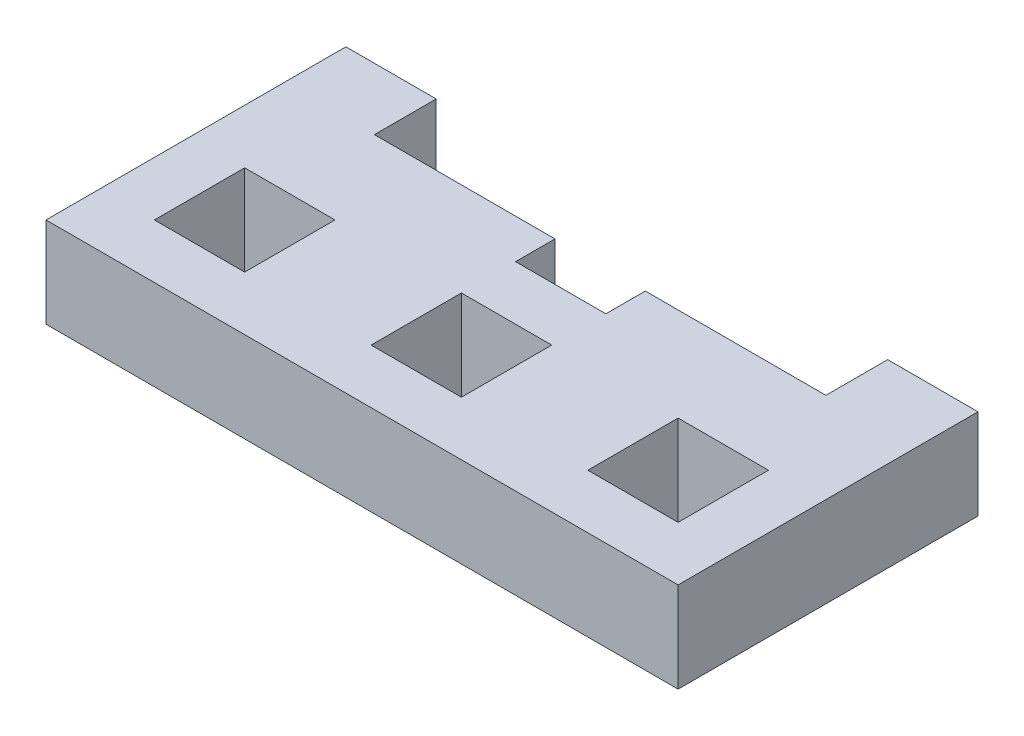
ISO-10303-21;
HEADER;
FILE_DESCRIPTION(('STEP AP214'),'2;1');
FILE_NAME('part.step','',(''),(''),'','','');
FILE_SCHEMA(('AUTOMOTIVE_DESIGN { 1 0 10303 214 1 1 1 1 }'));
ENDSEC;
DATA;
#1=APPLICATION_CONTEXT('core data for automotive mechanical design processes');
#2=APPLICATION_PROTOCOL_DEFINITION('international standard','automotive_design',2000,#1);
#3=PRODUCT_CONTEXT('',#1,'mechanical');
#4=PRODUCT('Part','Part','',(#3));
#5=PRODUCT_RELATED_PRODUCT_CATEGORY('part','',(#4));
#6=PRODUCT_DEFINITION_FORMATION('','',#4);
#7=PRODUCT_DEFINITION_CONTEXT('part definition',#1,'design');
#8=PRODUCT_DEFINITION('design','',#6,#7);
#9=PRODUCT_DEFINITION_SHAPE('','',#8);
#10=(LENGTH_UNIT() NAMED_UNIT(*) SI_UNIT(.MILLI.,.METRE.));
#11=(NAMED_UNIT(*) PLANE_ANGLE_UNIT() SI_UNIT($,.RADIAN.));
#12=(NAMED_UNIT(*) SI_UNIT($,.STERADIAN.) SOLID_ANGLE_UNIT());
#13=UNCERTAINTY_MEASURE_WITH_UNIT(LENGTH_MEASURE(1.E-05),#10,'distance_accuracy_value','');
#14=(GEOMETRIC_REPRESENTATION_CONTEXT(3) GLOBAL_UNCERTAINTY_ASSIGNED_CONTEXT((#13)) GLOBAL_UNIT_ASSIGNED_CONTEXT((#10,
#11,#12)) REPRESENTATION_CONTEXT('',''));
#15=CARTESIAN_POINT('',(0.,0.,0.));
#16=DIRECTION('',(0.,0.,1.));
#17=DIRECTION('',(1.,0.,0.));
#18=AXIS2_PLACEMENT_3D('',#15,#16,#17);
#19=CARTESIAN_POINT('',(0.,6.35,0.));
#20=DIRECTION('',(0.,-1.,0.));
#21=DIRECTION('',(0.,0.,-1.));
#22=AXIS2_PLACEMENT_3D('',#19,#20,#21);
#23=PLANE('',#22);
#24=DIRECTION('',(0.,0.,-1.));
#25=VECTOR('',#24,1.);
#26=CARTESIAN_POINT('',(18.415,6.35,3.175));
#27=LINE('',#26,#25);
#28=CARTESIAN_POINT('',(18.415,6.35,3.175));
#29=VERTEX_POINT('',#28);
#30=CARTESIAN_POINT('',(18.415,6.35,-3.175));
#31=VERTEX_POINT('',#30);
#32=EDGE_CURVE('E229',#29,#31,#27,.T.);
#33=ORIENTED_EDGE('',*,*,#32,.F.);
#34=DIRECTION('',(1.,0.,0.));
#35=VECTOR('',#34,1.);
#36=CARTESIAN_POINT('',(18.415,6.35,3.175));
#37=LINE('',#36,#35);
#38=CARTESIAN_POINT('',(12.065,6.35,3.175));
#39=VERTEX_POINT('',#38);
#40=EDGE_CURVE('E237',#39,#29,#37,.T.);
#41=ORIENTED_EDGE('',*,*,#40,.F.);
#42=DIRECTION('',(0.,0.,1.));
#43=VECTOR('',#42,1.);
#44=CARTESIAN_POINT('',(12.065,6.35,3.175));
#45=LINE('',#44,#43);
#46=CARTESIAN_POINT('',(12.065,6.35,-3.175));
#47=VERTEX_POINT('',#46);
#48=EDGE_CURVE('E234',#47,#39,#45,.T.);
#49=ORIENTED_EDGE('',*,*,#48,.F.);
#50=DIRECTION('',(-1.,0.,0.));
#51=VECTOR('',#50,1.);
#52=CARTESIAN_POINT('',(18.415,6.35,-3.175));
#53=LINE('',#52,#51);
#54=EDGE_CURVE('E231',#31,#47,#53,.T.);
#55=ORIENTED_EDGE('',*,*,#54,.F.);
#56=EDGE_LOOP('',(#33,#41,#49,#55));
#57=FACE_BOUND('',#56,.T.);
#58=DIRECTION('',(0.,0.,1.));
#59=VECTOR('',#58,1.);
#60=CARTESIAN_POINT('',(-22.225,6.35,6.985));
#61=LINE('',#60,#59);
#62=CARTESIAN_POINT('',(-22.225,6.35,-14.102499989));
#63=VERTEX_POINT('',#62);
#64=CARTESIAN_POINT('',(-22.225,6.35,6.985));
#65=VERTEX_POINT('',#64);
#66=EDGE_CURVE('E291',#63,#65,#61,.T.);
#67=ORIENTED_EDGE('',*,*,#66,.T.);
#68=DIRECTION('',(1.,0.,0.));
#69=VECTOR('',#68,1.);
#70=CARTESIAN_POINT('',(-22.225,6.35,6.985));
#71=LINE('',#70,#69);
#72=CARTESIAN_POINT('',(22.225,6.35,6.985));
#73=VERTEX_POINT('',#72);
#74=EDGE_CURVE('E294',#65,#73,#71,.T.);
#75=ORIENTED_EDGE('',*,*,#74,.T.);
#76=DIRECTION('',(0.,0.,-1.));
#77=VECTOR('',#76,1.);
#78=CARTESIAN_POINT('',(22.225,6.35,6.985));
#79=LINE('',#78,#77);
#80=CARTESIAN_POINT('',(22.225,6.35,-14.102499989));
#81=VERTEX_POINT('',#80);
#82=EDGE_CURVE('E297',#73,#81,#79,.T.);
#83=ORIENTED_EDGE('',*,*,#82,.T.);
#84=DIRECTION('',(-1.,0.,0.));
#85=VECTOR('',#84,1.);
#86=CARTESIAN_POINT('',(22.225,6.35,-14.102499989));
#87=LINE('',#86,#85);
#88=CARTESIAN_POINT('',(15.875,6.35,-14.102499989));
#89=VERTEX_POINT('',#88);
#90=EDGE_CURVE('E299',#81,#89,#87,.T.);
#91=ORIENTED_EDGE('',*,*,#90,.T.);
#92=DIRECTION('',(0.,0.,1.));
#93=VECTOR('',#92,1.);
#94=CARTESIAN_POINT('',(15.875,6.35,-14.102499989));
#95=LINE('',#94,#93);
#96=CARTESIAN_POINT('',(15.875,6.35,-9.75750004299999));
#97=VERTEX_POINT('',#96);
#98=EDGE_CURVE('E301',#89,#97,#95,.T.);
#99=ORIENTED_EDGE('',*,*,#98,.T.);
#100=DIRECTION('',(-1.,0.,0.));
#101=VECTOR('',#100,1.);
#102=CARTESIAN_POINT('',(3.175,6.35,-9.75750004299999));
#103=LINE('',#102,#101);
#104=CARTESIAN_POINT('',(3.175,6.35,-9.75750004299999));
#105=VERTEX_POINT('',#104);
#106=EDGE_CURVE('E303',#97,#105,#103,.T.);
#107=ORIENTED_EDGE('',*,*,#106,.T.);
#108=DIRECTION('',(0.,0.,1.));
#109=VECTOR('',#108,1.);
#110=CARTESIAN_POINT('',(3.175,6.35,-6.985));
#111=LINE('',#110,#109);
#112=CARTESIAN_POINT('',(3.175,6.35,-6.985));
#113=VERTEX_POINT('',#112);
#114=EDGE_CURVE('E305',#105,#113,#111,.T.);
#115=ORIENTED_EDGE('',*,*,#114,.T.);
#116=DIRECTION('',(-1.,0.,0.));
#117=VECTOR('',#116,1.);
#118=CARTESIAN_POINT('',(-3.175,6.35,-6.98500000000001));
#119=LINE('',#118,#117);
#120=CARTESIAN_POINT('',(-3.175,6.35,-6.98500000000001));
#121=VERTEX_POINT('',#120);
#122=EDGE_CURVE('E307',#113,#121,#119,.T.);
#123=ORIENTED_EDGE('',*,*,#122,.T.);
#124=DIRECTION('',(0.,0.,-1.));
#125=VECTOR('',#124,1.);
#126=CARTESIAN_POINT('',(-3.175,6.35,-9.75750004299999));
#127=LINE('',#126,#125);
#128=CARTESIAN_POINT('',(-3.175,6.35,-9.75750004299999));
#129=VERTEX_POINT('',#128);
#130=EDGE_CURVE('E309',#121,#129,#127,.T.);
#131=ORIENTED_EDGE('',*,*,#130,.T.);
#132=DIRECTION('',(-1.,0.,0.));
#133=VECTOR('',#132,1.);
#134=CARTESIAN_POINT('',(-15.875,6.35,-9.75750004299999));
#135=LINE('',#134,#133);
#136=CARTESIAN_POINT('',(-15.875,6.35,-9.75750004299999));
#137=VERTEX_POINT('',#136);
#138=EDGE_CURVE('E311',#129,#137,#135,.T.);
#139=ORIENTED_EDGE('',*,*,#138,.T.);
#140=DIRECTION('',(0.,0.,-1.));
#141=VECTOR('',#140,1.);
#142=CARTESIAN_POINT('',(-15.875,6.35,-14.102499989));
#143=LINE('',#142,#141);
#144=CARTESIAN_POINT('',(-15.875,6.35,-14.102499989));
#145=VERTEX_POINT('',#144);
#146=EDGE_CURVE('E313',#137,#145,#143,.T.);
#147=ORIENTED_EDGE('',*,*,#146,.T.);
#148=DIRECTION('',(-1.,0.,0.));
#149=VECTOR('',#148,1.);
#150=CARTESIAN_POINT('',(-22.225,6.35,-14.102499989));
#151=LINE('',#150,#149);
#152=EDGE_CURVE('E315',#145,#63,#151,.T.);
#153=ORIENTED_EDGE('',*,*,#152,.T.);
#154=EDGE_LOOP('',(#67,#75,#83,#91,#99,#107,#115,#123,#131,#139,#147,#153));
#155=FACE_BOUND('',#154,.T.);
#156=DIRECTION('',(0.,0.,-1.));
#157=VECTOR('',#156,1.);
#158=CARTESIAN_POINT('',(3.175,6.35,-3.17500000000001));
#159=LINE('',#158,#157);
#160=CARTESIAN_POINT('',(3.175,6.35,3.17500000000001));
#161=VERTEX_POINT('',#160);
#162=CARTESIAN_POINT('',(3.175,6.35,-3.17500000000001));
#163=VERTEX_POINT('',#162);
#164=EDGE_CURVE('E260',#161,#163,#159,.T.);
#165=ORIENTED_EDGE('',*,*,#164,.F.);
#166=DIRECTION('',(1.,0.,0.));
#167=VECTOR('',#166,1.);
#168=CARTESIAN_POINT('',(-3.17500000000002,6.35,3.17500000000002));
#169=LINE('',#168,#167);
#170=CARTESIAN_POINT('',(-3.17500000000002,6.35,3.17500000000002));
#171=VERTEX_POINT('',#170);
#172=EDGE_CURVE('E268',#171,#161,#169,.T.);
#173=ORIENTED_EDGE('',*,*,#172,.F.);
#174=DIRECTION('',(0.,0.,1.));
#175=VECTOR('',#174,1.);
#176=CARTESIAN_POINT('',(-3.17500000000002,6.35,-3.17500000000001));
#177=LINE('',#176,#175);
#178=CARTESIAN_POINT('',(-3.17500000000002,6.35,-3.17500000000001));
#179=VERTEX_POINT('',#178);
#180=EDGE_CURVE('E265',#179,#171,#177,.T.);
#181=ORIENTED_EDGE('',*,*,#180,.F.);
#182=DIRECTION('',(-1.,0.,0.));
#183=VECTOR('',#182,1.);
#184=CARTESIAN_POINT('',(-3.17500000000002,6.35,-3.17500000000001));
#185=LINE('',#184,#183);
#186=EDGE_CURVE('E262',#163,#179,#185,.T.);
#187=ORIENTED_EDGE('',*,*,#186,.F.);
#188=EDGE_LOOP('',(#165,#173,#181,#187));
#189=FACE_BOUND('',#188,.T.);
#190=DIRECTION('',(1.,0.,0.));
#191=VECTOR('',#190,1.);
#192=CARTESIAN_POINT('',(-18.415,6.35,3.175));
#193=LINE('',#192,#191);
#194=CARTESIAN_POINT('',(-18.415,6.35,3.175));
#195=VERTEX_POINT('',#194);
#196=CARTESIAN_POINT('',(-12.065,6.35,3.175));
#197=VERTEX_POINT('',#196);
#198=EDGE_CURVE('E193',#195,#197,#193,.T.);
#199=ORIENTED_EDGE('',*,*,#198,.F.);
#200=DIRECTION('',(0.,0.,1.));
#201=VECTOR('',#200,1.);
#202=CARTESIAN_POINT('',(-18.415,6.35,3.175));
#203=LINE('',#202,#201);
#204=CARTESIAN_POINT('',(-18.415,6.35,-3.175));
#205=VERTEX_POINT('',#204);
#206=EDGE_CURVE('E215',#205,#195,#203,.T.);
#207=ORIENTED_EDGE('',*,*,#206,.F.);
#208=DIRECTION('',(-1.,0.,0.));
#209=VECTOR('',#208,1.);
#210=CARTESIAN_POINT('',(-18.415,6.35,-3.175));
#211=LINE('',#210,#209);
#212=CARTESIAN_POINT('',(-12.065,6.35,-3.175));
#213=VERTEX_POINT('',#212);
#214=EDGE_CURVE('E213',#213,#205,#211,.T.);
#215=ORIENTED_EDGE('',*,*,#214,.F.);
#216=DIRECTION('',(0.,0.,-1.));
#217=VECTOR('',#216,1.);
#218=CARTESIAN_POINT('',(-12.065,6.35,3.175));
#219=LINE('',#218,#217);
#220=EDGE_CURVE('E201',#197,#213,#219,.T.);
#221=ORIENTED_EDGE('',*,*,#220,.F.);
#222=EDGE_LOOP('',(#199,#207,#215,#221));
#223=FACE_BOUND('',#222,.T.);
#224=ADVANCED_FACE('F32',(#57,#155,#189,#223),#23,.F.);
#225=CARTESIAN_POINT('',(0.,0.,0.));
#226=DIRECTION('',(0.,-1.,0.));
#227=DIRECTION('',(0.,0.,-1.));
#228=AXIS2_PLACEMENT_3D('',#225,#226,#227);
#229=PLANE('',#228);
#230=DIRECTION('',(1.,0.,0.));
#231=VECTOR('',#230,1.);
#232=CARTESIAN_POINT('',(18.415,0.,3.175));
#233=LINE('',#232,#231);
#234=CARTESIAN_POINT('',(12.065,0.,3.175));
#235=VERTEX_POINT('',#234);
#236=CARTESIAN_POINT('',(18.415,0.,3.175));
#237=VERTEX_POINT('',#236);
#238=EDGE_CURVE('E232',#235,#237,#233,.T.);
#239=ORIENTED_EDGE('',*,*,#238,.T.);
#240=DIRECTION('',(0.,0.,-1.));
#241=VECTOR('',#240,1.);
#242=CARTESIAN_POINT('',(18.415,0.,3.175));
#243=LINE('',#242,#241);
#244=CARTESIAN_POINT('',(18.415,0.,-3.175));
#245=VERTEX_POINT('',#244);
#246=EDGE_CURVE('E209',#237,#245,#243,.T.);
#247=ORIENTED_EDGE('',*,*,#246,.T.);
#248=DIRECTION('',(-1.,0.,0.));
#249=VECTOR('',#248,1.);
#250=CARTESIAN_POINT('',(18.415,0.,-3.175));
#251=LINE('',#250,#249);
#252=CARTESIAN_POINT('',(12.065,0.,-3.175));
#253=VERTEX_POINT('',#252);
#254=EDGE_CURVE('E242',#245,#253,#251,.T.);
#255=ORIENTED_EDGE('',*,*,#254,.T.);
#256=DIRECTION('',(0.,0.,1.));
#257=VECTOR('',#256,1.);
#258=CARTESIAN_POINT('',(12.065,0.,3.175));
#259=LINE('',#258,#257);
#260=EDGE_CURVE('E245',#253,#235,#259,.T.);
#261=ORIENTED_EDGE('',*,*,#260,.T.);
#262=EDGE_LOOP('',(#239,#247,#255,#261));
#263=FACE_BOUND('',#262,.T.);
#264=DIRECTION('',(1.,0.,0.));
#265=VECTOR('',#264,1.);
#266=CARTESIAN_POINT('',(-22.225,0.,6.985));
#267=LINE('',#266,#265);
#268=CARTESIAN_POINT('',(-22.225,0.,6.985));
#269=VERTEX_POINT('',#268);
#270=CARTESIAN_POINT('',(22.225,0.,6.985));
#271=VERTEX_POINT('',#270);
#272=EDGE_CURVE('E290',#269,#271,#267,.T.);
#273=ORIENTED_EDGE('',*,*,#272,.F.);
#274=DIRECTION('',(0.,0.,1.));
#275=VECTOR('',#274,1.);
#276=CARTESIAN_POINT('',(-22.225,0.,-9.75750004299999));
#277=LINE('',#276,#275);
#278=CARTESIAN_POINT('',(-22.225,0.,-14.102499989));
#279=VERTEX_POINT('',#278);
#280=EDGE_CURVE('E295',#279,#269,#277,.T.);
#281=ORIENTED_EDGE('',*,*,#280,.F.);
#282=DIRECTION('',(-1.,0.,0.));
#283=VECTOR('',#282,1.);
#284=CARTESIAN_POINT('',(-22.225,0.,-14.102499989));
#285=LINE('',#284,#283);
#286=CARTESIAN_POINT('',(-15.875,0.,-14.102499989));
#287=VERTEX_POINT('',#286);
#288=EDGE_CURVE('E339',#287,#279,#285,.T.);
#289=ORIENTED_EDGE('',*,*,#288,.F.);
#290=DIRECTION('',(0.,0.,-1.));
#291=VECTOR('',#290,1.);
#292=CARTESIAN_POINT('',(-15.875,0.,-14.102499989));
#293=LINE('',#292,#291);
#294=CARTESIAN_POINT('',(-15.875,0.,-9.75750004299999));
#295=VERTEX_POINT('',#294);
#296=EDGE_CURVE('E337',#295,#287,#293,.T.);
#297=ORIENTED_EDGE('',*,*,#296,.F.);
#298=DIRECTION('',(-1.,0.,0.));
#299=VECTOR('',#298,1.);
#300=CARTESIAN_POINT('',(-15.875,0.,-9.75750004299999));
#301=LINE('',#300,#299);
#302=CARTESIAN_POINT('',(-3.175,0.,-9.75750004299999));
#303=VERTEX_POINT('',#302);
#304=EDGE_CURVE('E335',#303,#295,#301,.T.);
#305=ORIENTED_EDGE('',*,*,#304,.F.);
#306=DIRECTION('',(0.,0.,-1.));
#307=VECTOR('',#306,1.);
#308=CARTESIAN_POINT('',(-3.175,0.,-9.75750004299999));
#309=LINE('',#308,#307);
#310=CARTESIAN_POINT('',(-3.175,0.,-6.98500000000001));
#311=VERTEX_POINT('',#310);
#312=EDGE_CURVE('E333',#311,#303,#309,.T.);
#313=ORIENTED_EDGE('',*,*,#312,.F.);
#314=DIRECTION('',(-1.,0.,0.));
#315=VECTOR('',#314,1.);
#316=CARTESIAN_POINT('',(-3.175,0.,-6.98500000000001));
#317=LINE('',#316,#315);
#318=CARTESIAN_POINT('',(3.175,0.,-6.985));
#319=VERTEX_POINT('',#318);
#320=EDGE_CURVE('E331',#319,#311,#317,.T.);
#321=ORIENTED_EDGE('',*,*,#320,.F.);
#322=DIRECTION('',(0.,0.,1.));
#323=VECTOR('',#322,1.);
#324=CARTESIAN_POINT('',(3.175,0.,-6.985));
#325=LINE('',#324,#323);
#326=CARTESIAN_POINT('',(3.175,0.,-9.75750004299999));
#327=VERTEX_POINT('',#326);
#328=EDGE_CURVE('E329',#327,#319,#325,.T.);
#329=ORIENTED_EDGE('',*,*,#328,.F.);
#330=DIRECTION('',(-1.,0.,0.));
#331=VECTOR('',#330,1.);
#332=CARTESIAN_POINT('',(3.175,0.,-9.75750004299999));
#333=LINE('',#332,#331);
#334=CARTESIAN_POINT('',(15.875,0.,-9.75750004299999));
#335=VERTEX_POINT('',#334);
#336=EDGE_CURVE('E327',#335,#327,#333,.T.);
#337=ORIENTED_EDGE('',*,*,#336,.F.);
#338=DIRECTION('',(0.,0.,1.));
#339=VECTOR('',#338,1.);
#340=CARTESIAN_POINT('',(15.875,0.,-14.102499989));
#341=LINE('',#340,#339);
#342=CARTESIAN_POINT('',(15.875,0.,-14.102499989));
#343=VERTEX_POINT('',#342);
#344=EDGE_CURVE('E325',#343,#335,#341,.T.);
#345=ORIENTED_EDGE('',*,*,#344,.F.);
#346=DIRECTION('',(-1.,0.,0.));
#347=VECTOR('',#346,1.);
#348=CARTESIAN_POINT('',(22.225,0.,-14.102499989));
#349=LINE('',#348,#347);
#350=CARTESIAN_POINT('',(22.225,0.,-14.102499989));
#351=VERTEX_POINT('',#350);
#352=EDGE_CURVE('E323',#351,#343,#349,.T.);
#353=ORIENTED_EDGE('',*,*,#352,.F.);
#354=DIRECTION('',(0.,0.,-1.));
#355=VECTOR('',#354,1.);
#356=CARTESIAN_POINT('',(22.225,0.,-9.75750004299999));
#357=LINE('',#356,#355);
#358=EDGE_CURVE('E321',#271,#351,#357,.T.);
#359=ORIENTED_EDGE('',*,*,#358,.F.);
#360=EDGE_LOOP('',(#273,#281,#289,#297,#305,#313,#321,#329,#337,#345,#353,#359));
#361=FACE_BOUND('',#360,.T.);
#362=DIRECTION('',(1.,0.,0.));
#363=VECTOR('',#362,1.);
#364=CARTESIAN_POINT('',(-3.17500000000002,0.,3.17500000000002));
#365=LINE('',#364,#363);
#366=CARTESIAN_POINT('',(-3.17500000000002,0.,3.17500000000002));
#367=VERTEX_POINT('',#366);
#368=CARTESIAN_POINT('',(3.175,0.,3.17500000000001));
#369=VERTEX_POINT('',#368);
#370=EDGE_CURVE('E263',#367,#369,#365,.T.);
#371=ORIENTED_EDGE('',*,*,#370,.T.);
#372=DIRECTION('',(0.,0.,-1.));
#373=VECTOR('',#372,1.);
#374=CARTESIAN_POINT('',(3.175,0.,-3.17500000000001));
#375=LINE('',#374,#373);
#376=CARTESIAN_POINT('',(3.175,0.,-3.17500000000001));
#377=VERTEX_POINT('',#376);
#378=EDGE_CURVE('E259',#369,#377,#375,.T.);
#379=ORIENTED_EDGE('',*,*,#378,.T.);
#380=DIRECTION('',(-1.,0.,0.));
#381=VECTOR('',#380,1.);
#382=CARTESIAN_POINT('',(-3.17500000000002,0.,-3.17500000000001));
#383=LINE('',#382,#381);
#384=CARTESIAN_POINT('',(-3.17500000000002,0.,-3.17500000000001));
#385=VERTEX_POINT('',#384);
#386=EDGE_CURVE('E273',#377,#385,#383,.T.);
#387=ORIENTED_EDGE('',*,*,#386,.T.);
#388=DIRECTION('',(0.,0.,1.));
#389=VECTOR('',#388,1.);
#390=CARTESIAN_POINT('',(-3.17500000000002,0.,-3.17500000000001));
#391=LINE('',#390,#389);
#392=EDGE_CURVE('E276',#385,#367,#391,.T.);
#393=ORIENTED_EDGE('',*,*,#392,.T.);
#394=EDGE_LOOP('',(#371,#379,#387,#393));
#395=FACE_BOUND('',#394,.T.);
#396=DIRECTION('',(0.,0.,1.));
#397=VECTOR('',#396,1.);
#398=CARTESIAN_POINT('',(-18.415,0.,3.175));
#399=LINE('',#398,#397);
#400=CARTESIAN_POINT('',(-18.415,0.,-3.175));
#401=VERTEX_POINT('',#400);
#402=CARTESIAN_POINT('',(-18.415,0.,3.175));
#403=VERTEX_POINT('',#402);
#404=EDGE_CURVE('E202',#401,#403,#399,.T.);
#405=ORIENTED_EDGE('',*,*,#404,.T.);
#406=DIRECTION('',(1.,0.,0.));
#407=VECTOR('',#406,1.);
#408=CARTESIAN_POINT('',(-18.415,0.,3.175));
#409=LINE('',#408,#407);
#410=CARTESIAN_POINT('',(-12.065,0.,3.175));
#411=VERTEX_POINT('',#410);
#412=EDGE_CURVE('E55',#403,#411,#409,.T.);
#413=ORIENTED_EDGE('',*,*,#412,.T.);
#414=DIRECTION('',(0.,0.,-1.));
#415=VECTOR('',#414,1.);
#416=CARTESIAN_POINT('',(-12.065,0.,3.175));
#417=LINE('',#416,#415);
#418=CARTESIAN_POINT('',(-12.065,0.,-3.175));
#419=VERTEX_POINT('',#418);
#420=EDGE_CURVE('E208',#411,#419,#417,.T.);
#421=ORIENTED_EDGE('',*,*,#420,.T.);
#422=DIRECTION('',(-1.,0.,0.));
#423=VECTOR('',#422,1.);
#424=CARTESIAN_POINT('',(-18.415,0.,-3.175));
#425=LINE('',#424,#423);
#426=EDGE_CURVE('E221',#419,#401,#425,.T.);
#427=ORIENTED_EDGE('',*,*,#426,.T.);
#428=EDGE_LOOP('',(#405,#413,#421,#427));
#429=FACE_BOUND('',#428,.T.);
#430=ADVANCED_FACE('F381',(#263,#361,#395,#429),#229,.T.);
#431=CARTESIAN_POINT('',(-22.225,6.35,6.985));
#432=DIRECTION('',(0.,0.,-1.));
#433=DIRECTION('',(-1.,0.,0.));
#434=AXIS2_PLACEMENT_3D('',#431,#432,#433);
#435=PLANE('',#434);
#436=ORIENTED_EDGE('',*,*,#272,.T.);
#437=DIRECTION('',(0.,-1.,0.));
#438=VECTOR('',#437,1.);
#439=CARTESIAN_POINT('',(22.225,6.35,6.985));
#440=LINE('',#439,#438);
#441=EDGE_CURVE('E40',#73,#271,#440,.T.);
#442=ORIENTED_EDGE('',*,*,#441,.F.);
#443=ORIENTED_EDGE('',*,*,#74,.F.);
#444=DIRECTION('',(0.,-1.,0.));
#445=VECTOR('',#444,1.);
#446=CARTESIAN_POINT('',(-22.225,6.35,6.985));
#447=LINE('',#446,#445);
#448=EDGE_CURVE('E11',#65,#269,#447,.T.);
#449=ORIENTED_EDGE('',*,*,#448,.T.);
#450=EDGE_LOOP('',(#436,#442,#443,#449));
#451=FACE_BOUND('',#450,.T.);
#452=ADVANCED_FACE('F34',(#451),#435,.F.);
#453=CARTESIAN_POINT('',(22.225,6.35,-9.75750004299999));
#454=DIRECTION('',(-1.,0.,0.));
#455=DIRECTION('',(0.,0.,1.));
#456=AXIS2_PLACEMENT_3D('',#453,#454,#455);
#457=PLANE('',#456);
#458=ORIENTED_EDGE('',*,*,#358,.T.);
#459=DIRECTION('',(0.,-1.,0.));
#460=VECTOR('',#459,1.);
#461=CARTESIAN_POINT('',(22.225,6.35,-14.102499989));
#462=LINE('',#461,#460);
#463=EDGE_CURVE('E368',#81,#351,#462,.T.);
#464=ORIENTED_EDGE('',*,*,#463,.F.);
#465=ORIENTED_EDGE('',*,*,#82,.F.);
#466=ORIENTED_EDGE('',*,*,#441,.T.);
#467=EDGE_LOOP('',(#458,#464,#465,#466));
#468=FACE_BOUND('',#467,.T.);
#469=ADVANCED_FACE('F374',(#468),#457,.F.);
#470=CARTESIAN_POINT('',(22.225,6.35,-14.102499989));
#471=DIRECTION('',(0.,0.,1.));
#472=DIRECTION('',(1.,0.,0.));
#473=AXIS2_PLACEMENT_3D('',#470,#471,#472);
#474=PLANE('',#473);
#475=ORIENTED_EDGE('',*,*,#352,.T.);
#476=DIRECTION('',(0.,-1.,0.));
#477=VECTOR('',#476,1.);
#478=CARTESIAN_POINT('',(15.875,6.35,-14.102499989));
#479=LINE('',#478,#477);
#480=EDGE_CURVE('E365',#89,#343,#479,.T.);
#481=ORIENTED_EDGE('',*,*,#480,.F.);
#482=ORIENTED_EDGE('',*,*,#90,.F.);
#483=ORIENTED_EDGE('',*,*,#463,.T.);
#484=EDGE_LOOP('',(#475,#481,#482,#483));
#485=FACE_BOUND('',#484,.T.);
#486=ADVANCED_FACE('F389',(#485),#474,.F.);
#487=CARTESIAN_POINT('',(15.875,6.35,-14.102499989));
#488=DIRECTION('',(1.,0.,0.));
#489=DIRECTION('',(0.,0.,-1.));
#490=AXIS2_PLACEMENT_3D('',#487,#488,#489);
#491=PLANE('',#490);
#492=ORIENTED_EDGE('',*,*,#344,.T.);
#493=DIRECTION('',(0.,-1.,0.));
#494=VECTOR('',#493,1.);
#495=CARTESIAN_POINT('',(15.875,6.35,-9.75750004299999));
#496=LINE('',#495,#494);
#497=EDGE_CURVE('E362',#97,#335,#496,.T.);
#498=ORIENTED_EDGE('',*,*,#497,.F.);
#499=ORIENTED_EDGE('',*,*,#98,.F.);
#500=ORIENTED_EDGE('',*,*,#480,.T.);
#501=EDGE_LOOP('',(#492,#498,#499,#500));
#502=FACE_BOUND('',#501,.T.);
#503=ADVANCED_FACE('F393',(#502),#491,.F.);
#504=CARTESIAN_POINT('',(3.175,6.35,-9.75750004299999));
#505=DIRECTION('',(0.,0.,1.));
#506=DIRECTION('',(1.,0.,0.));
#507=AXIS2_PLACEMENT_3D('',#504,#505,#506);
#508=PLANE('',#507);
#509=ORIENTED_EDGE('',*,*,#336,.T.);
#510=DIRECTION('',(0.,-1.,0.));
#511=VECTOR('',#510,1.);
#512=CARTESIAN_POINT('',(3.175,6.35,-9.75750004299999));
#513=LINE('',#512,#511);
#514=EDGE_CURVE('E359',#105,#327,#513,.T.);
#515=ORIENTED_EDGE('',*,*,#514,.F.);
#516=ORIENTED_EDGE('',*,*,#106,.F.);
#517=ORIENTED_EDGE('',*,*,#497,.T.);
#518=EDGE_LOOP('',(#509,#515,#516,#517));
#519=FACE_BOUND('',#518,.T.);
#520=ADVANCED_FACE('F431',(#519),#508,.F.);
#521=CARTESIAN_POINT('',(3.175,6.35,-6.985));
#522=DIRECTION('',(1.,0.,0.));
#523=DIRECTION('',(0.,0.,-1.));
#524=AXIS2_PLACEMENT_3D('',#521,#522,#523);
#525=PLANE('',#524);
#526=ORIENTED_EDGE('',*,*,#328,.T.);
#527=DIRECTION('',(0.,-1.,0.));
#528=VECTOR('',#527,1.);
#529=CARTESIAN_POINT('',(3.175,6.35,-6.985));
#530=LINE('',#529,#528);
#531=EDGE_CURVE('E356',#113,#319,#530,.T.);
#532=ORIENTED_EDGE('',*,*,#531,.F.);
#533=ORIENTED_EDGE('',*,*,#114,.F.);
#534=ORIENTED_EDGE('',*,*,#514,.T.);
#535=EDGE_LOOP('',(#526,#532,#533,#534));
#536=FACE_BOUND('',#535,.T.);
#537=ADVANCED_FACE('F429',(#536),#525,.F.);
#538=CARTESIAN_POINT('',(-3.175,6.35,-6.98500000000001));
#539=DIRECTION('',(0.,0.,1.));
#540=DIRECTION('',(1.,0.,0.));
#541=AXIS2_PLACEMENT_3D('',#538,#539,#540);
#542=PLANE('',#541);
#543=ORIENTED_EDGE('',*,*,#320,.T.);
#544=DIRECTION('',(0.,-1.,0.));
#545=VECTOR('',#544,1.);
#546=CARTESIAN_POINT('',(-3.175,6.35,-6.98500000000001));
#547=LINE('',#546,#545);
#548=EDGE_CURVE('E353',#121,#311,#547,.T.);
#549=ORIENTED_EDGE('',*,*,#548,.F.);
#550=ORIENTED_EDGE('',*,*,#122,.F.);
#551=ORIENTED_EDGE('',*,*,#531,.T.);
#552=EDGE_LOOP('',(#543,#549,#550,#551));
#553=FACE_BOUND('',#552,.T.);
#554=ADVANCED_FACE('F424',(#553),#542,.F.);
#555=CARTESIAN_POINT('',(-3.175,6.35,-9.75750004299999));
#556=DIRECTION('',(-1.,0.,0.));
#557=DIRECTION('',(0.,0.,1.));
#558=AXIS2_PLACEMENT_3D('',#555,#556,#557);
#559=PLANE('',#558);
#560=ORIENTED_EDGE('',*,*,#312,.T.);
#561=DIRECTION('',(0.,-1.,0.));
#562=VECTOR('',#561,1.);
#563=CARTESIAN_POINT('',(-3.175,6.35,-9.75750004299999));
#564=LINE('',#563,#562);
#565=EDGE_CURVE('E350',#129,#303,#564,.T.);
#566=ORIENTED_EDGE('',*,*,#565,.F.);
#567=ORIENTED_EDGE('',*,*,#130,.F.);
#568=ORIENTED_EDGE('',*,*,#548,.T.);
#569=EDGE_LOOP('',(#560,#566,#567,#568));
#570=FACE_BOUND('',#569,.T.);
#571=ADVANCED_FACE('F419',(#570),#559,.F.);
#572=CARTESIAN_POINT('',(-15.875,6.35,-9.75750004299999));
#573=DIRECTION('',(0.,0.,1.));
#574=DIRECTION('',(1.,0.,0.));
#575=AXIS2_PLACEMENT_3D('',#572,#573,#574);
#576=PLANE('',#575);
#577=ORIENTED_EDGE('',*,*,#304,.T.);
#578=DIRECTION('',(0.,-1.,0.));
#579=VECTOR('',#578,1.);
#580=CARTESIAN_POINT('',(-15.875,6.35,-9.75750004299999));
#581=LINE('',#580,#579);
#582=EDGE_CURVE('E347',#137,#295,#581,.T.);
#583=ORIENTED_EDGE('',*,*,#582,.F.);
#584=ORIENTED_EDGE('',*,*,#138,.F.);
#585=ORIENTED_EDGE('',*,*,#565,.T.);
#586=EDGE_LOOP('',(#577,#583,#584,#585));
#587=FACE_BOUND('',#586,.T.);
#588=ADVANCED_FACE('F415',(#587),#576,.F.);
#589=CARTESIAN_POINT('',(-15.875,6.35,-14.102499989));
#590=DIRECTION('',(-1.,0.,0.));
#591=DIRECTION('',(0.,0.,1.));
#592=AXIS2_PLACEMENT_3D('',#589,#590,#591);
#593=PLANE('',#592);
#594=ORIENTED_EDGE('',*,*,#296,.T.);
#595=DIRECTION('',(0.,-1.,0.));
#596=VECTOR('',#595,1.);
#597=CARTESIAN_POINT('',(-15.875,6.35,-14.102499989));
#598=LINE('',#597,#596);
#599=EDGE_CURVE('E344',#145,#287,#598,.T.);
#600=ORIENTED_EDGE('',*,*,#599,.F.);
#601=ORIENTED_EDGE('',*,*,#146,.F.);
#602=ORIENTED_EDGE('',*,*,#582,.T.);
#603=EDGE_LOOP('',(#594,#600,#601,#602));
#604=FACE_BOUND('',#603,.T.);
#605=ADVANCED_FACE('F410',(#604),#593,.F.);
#606=CARTESIAN_POINT('',(-22.225,6.35,-14.102499989));
#607=DIRECTION('',(0.,0.,1.));
#608=DIRECTION('',(1.,0.,0.));
#609=AXIS2_PLACEMENT_3D('',#606,#607,#608);
#610=PLANE('',#609);
#611=ORIENTED_EDGE('',*,*,#288,.T.);
#612=DIRECTION('',(0.,-1.,0.));
#613=VECTOR('',#612,1.);
#614=CARTESIAN_POINT('',(-22.225,6.35,-14.102499989));
#615=LINE('',#614,#613);
#616=EDGE_CURVE('E318',#63,#279,#615,.T.);
#617=ORIENTED_EDGE('',*,*,#616,.F.);
#618=ORIENTED_EDGE('',*,*,#152,.F.);
#619=ORIENTED_EDGE('',*,*,#599,.T.);
#620=EDGE_LOOP('',(#611,#617,#618,#619));
#621=FACE_BOUND('',#620,.T.);
#622=ADVANCED_FACE('F404',(#621),#610,.F.);
#623=CARTESIAN_POINT('',(-22.225,6.35,-9.75750004299999));
#624=DIRECTION('',(1.,0.,0.));
#625=DIRECTION('',(0.,0.,-1.));
#626=AXIS2_PLACEMENT_3D('',#623,#624,#625);
#627=PLANE('',#626);
#628=ORIENTED_EDGE('',*,*,#280,.T.);
#629=ORIENTED_EDGE('',*,*,#448,.F.);
#630=ORIENTED_EDGE('',*,*,#66,.F.);
#631=ORIENTED_EDGE('',*,*,#616,.T.);
#632=EDGE_LOOP('',(#628,#629,#630,#631));
#633=FACE_BOUND('',#632,.T.);
#634=ADVANCED_FACE('F402',(#633),#627,.F.);
#635=CARTESIAN_POINT('',(3.175,6.35,-3.17500000000001));
#636=DIRECTION('',(-1.,0.,0.));
#637=DIRECTION('',(0.,0.,1.));
#638=AXIS2_PLACEMENT_3D('',#635,#636,#637);
#639=PLANE('',#638);
#640=ORIENTED_EDGE('',*,*,#378,.F.);
#641=DIRECTION('',(0.,-1.,0.));
#642=VECTOR('',#641,1.);
#643=CARTESIAN_POINT('',(3.175,6.35,3.17500000000001));
#644=LINE('',#643,#642);
#645=EDGE_CURVE('E270',#161,#369,#644,.T.);
#646=ORIENTED_EDGE('',*,*,#645,.F.);
#647=ORIENTED_EDGE('',*,*,#164,.T.);
#648=DIRECTION('',(0.,-1.,0.));
#649=VECTOR('',#648,1.);
#650=CARTESIAN_POINT('',(3.175,6.35,-3.17500000000001));
#651=LINE('',#650,#649);
#652=EDGE_CURVE('E287',#163,#377,#651,.T.);
#653=ORIENTED_EDGE('',*,*,#652,.T.);
#654=EDGE_LOOP('',(#640,#646,#647,#653));
#655=FACE_BOUND('',#654,.T.);
#656=ADVANCED_FACE('F450',(#655),#639,.T.);
#657=CARTESIAN_POINT('',(-3.17500000000002,6.35,-3.17500000000001));
#658=DIRECTION('',(0.,0.,1.));
#659=DIRECTION('',(1.,0.,0.));
#660=AXIS2_PLACEMENT_3D('',#657,#658,#659);
#661=PLANE('',#660);
#662=ORIENTED_EDGE('',*,*,#386,.F.);
#663=ORIENTED_EDGE('',*,*,#652,.F.);
#664=ORIENTED_EDGE('',*,*,#186,.T.);
#665=DIRECTION('',(0.,-1.,0.));
#666=VECTOR('',#665,1.);
#667=CARTESIAN_POINT('',(-3.17500000000002,6.35,-3.17500000000001));
#668=LINE('',#667,#666);
#669=EDGE_CURVE('E285',#179,#385,#668,.T.);
#670=ORIENTED_EDGE('',*,*,#669,.T.);
#671=EDGE_LOOP('',(#662,#663,#664,#670));
#672=FACE_BOUND('',#671,.T.);
#673=ADVANCED_FACE('F494',(#672),#661,.T.);
#674=CARTESIAN_POINT('',(-3.17500000000002,6.35,-3.17500000000001));
#675=DIRECTION('',(1.,0.,0.));
#676=DIRECTION('',(0.,0.,-1.));
#677=AXIS2_PLACEMENT_3D('',#674,#675,#676);
#678=PLANE('',#677);
#679=ORIENTED_EDGE('',*,*,#392,.F.);
#680=ORIENTED_EDGE('',*,*,#669,.F.);
#681=ORIENTED_EDGE('',*,*,#180,.T.);
#682=DIRECTION('',(0.,-1.,0.));
#683=VECTOR('',#682,1.);
#684=CARTESIAN_POINT('',(-3.17500000000002,6.35,3.17500000000002));
#685=LINE('',#684,#683);
#686=EDGE_CURVE('E283',#171,#367,#685,.T.);
#687=ORIENTED_EDGE('',*,*,#686,.T.);
#688=EDGE_LOOP('',(#679,#680,#681,#687));
#689=FACE_BOUND('',#688,.T.);
#690=ADVANCED_FACE('F501',(#689),#678,.T.);
#691=CARTESIAN_POINT('',(-3.17500000000002,6.35,3.17500000000002));
#692=DIRECTION('',(0.,0.,-1.));
#693=DIRECTION('',(-1.,0.,0.));
#694=AXIS2_PLACEMENT_3D('',#691,#692,#693);
#695=PLANE('',#694);
#696=ORIENTED_EDGE('',*,*,#370,.F.);
#697=ORIENTED_EDGE('',*,*,#686,.F.);
#698=ORIENTED_EDGE('',*,*,#172,.T.);
#699=ORIENTED_EDGE('',*,*,#645,.T.);
#700=EDGE_LOOP('',(#696,#697,#698,#699));
#701=FACE_BOUND('',#700,.T.);
#702=ADVANCED_FACE('F508',(#701),#695,.T.);
#703=CARTESIAN_POINT('',(18.415,6.35,3.175));
#704=DIRECTION('',(-1.,0.,0.));
#705=DIRECTION('',(0.,0.,1.));
#706=AXIS2_PLACEMENT_3D('',#703,#704,#705);
#707=PLANE('',#706);
#708=ORIENTED_EDGE('',*,*,#246,.F.);
#709=DIRECTION('',(0.,-1.,0.));
#710=VECTOR('',#709,1.);
#711=CARTESIAN_POINT('',(18.415,6.35,3.175));
#712=LINE('',#711,#710);
#713=EDGE_CURVE('E239',#29,#237,#712,.T.);
#714=ORIENTED_EDGE('',*,*,#713,.F.);
#715=ORIENTED_EDGE('',*,*,#32,.T.);
#716=DIRECTION('',(0.,-1.,0.));
#717=VECTOR('',#716,1.);
#718=CARTESIAN_POINT('',(18.415,6.35,-3.175));
#719=LINE('',#718,#717);
#720=EDGE_CURVE('E256',#31,#245,#719,.T.);
#721=ORIENTED_EDGE('',*,*,#720,.T.);
#722=EDGE_LOOP('',(#708,#714,#715,#721));
#723=FACE_BOUND('',#722,.T.);
#724=ADVANCED_FACE('F516',(#723),#707,.T.);
#725=CARTESIAN_POINT('',(18.415,6.35,-3.175));
#726=DIRECTION('',(0.,0.,1.));
#727=DIRECTION('',(1.,0.,0.));
#728=AXIS2_PLACEMENT_3D('',#725,#726,#727);
#729=PLANE('',#728);
#730=ORIENTED_EDGE('',*,*,#254,.F.);
#731=ORIENTED_EDGE('',*,*,#720,.F.);
#732=ORIENTED_EDGE('',*,*,#54,.T.);
#733=DIRECTION('',(0.,-1.,0.));
#734=VECTOR('',#733,1.);
#735=CARTESIAN_POINT('',(12.065,6.35,-3.175));
#736=LINE('',#735,#734);
#737=EDGE_CURVE('E254',#47,#253,#736,.T.);
#738=ORIENTED_EDGE('',*,*,#737,.T.);
#739=EDGE_LOOP('',(#730,#731,#732,#738));
#740=FACE_BOUND('',#739,.T.);
#741=ADVANCED_FACE('F524',(#740),#729,.T.);
#742=CARTESIAN_POINT('',(12.065,6.35,3.175));
#743=DIRECTION('',(1.,0.,0.));
#744=DIRECTION('',(0.,0.,-1.));
#745=AXIS2_PLACEMENT_3D('',#742,#743,#744);
#746=PLANE('',#745);
#747=ORIENTED_EDGE('',*,*,#260,.F.);
#748=ORIENTED_EDGE('',*,*,#737,.F.);
#749=ORIENTED_EDGE('',*,*,#48,.T.);
#750=DIRECTION('',(0.,-1.,0.));
#751=VECTOR('',#750,1.);
#752=CARTESIAN_POINT('',(12.065,6.35,3.175));
#753=LINE('',#752,#751);
#754=EDGE_CURVE('E252',#39,#235,#753,.T.);
#755=ORIENTED_EDGE('',*,*,#754,.T.);
#756=EDGE_LOOP('',(#747,#748,#749,#755));
#757=FACE_BOUND('',#756,.T.);
#758=ADVANCED_FACE('F532',(#757),#746,.T.);
#759=CARTESIAN_POINT('',(18.415,6.35,3.175));
#760=DIRECTION('',(0.,0.,-1.));
#761=DIRECTION('',(-1.,0.,0.));
#762=AXIS2_PLACEMENT_3D('',#759,#760,#761);
#763=PLANE('',#762);
#764=ORIENTED_EDGE('',*,*,#238,.F.);
#765=ORIENTED_EDGE('',*,*,#754,.F.);
#766=ORIENTED_EDGE('',*,*,#40,.T.);
#767=ORIENTED_EDGE('',*,*,#713,.T.);
#768=EDGE_LOOP('',(#764,#765,#766,#767));
#769=FACE_BOUND('',#768,.T.);
#770=ADVANCED_FACE('F540',(#769),#763,.T.);
#771=CARTESIAN_POINT('',(-18.415,6.35,3.175));
#772=DIRECTION('',(0.,0.,-1.));
#773=DIRECTION('',(-1.,0.,0.));
#774=AXIS2_PLACEMENT_3D('',#771,#772,#773);
#775=PLANE('',#774);
#776=ORIENTED_EDGE('',*,*,#412,.F.);
#777=DIRECTION('',(0.,-1.,0.));
#778=VECTOR('',#777,1.);
#779=CARTESIAN_POINT('',(-18.415,6.35,3.175));
#780=LINE('',#779,#778);
#781=EDGE_CURVE('E197',#195,#403,#780,.T.);
#782=ORIENTED_EDGE('',*,*,#781,.F.);
#783=ORIENTED_EDGE('',*,*,#198,.T.);
#784=DIRECTION('',(0.,-1.,0.));
#785=VECTOR('',#784,1.);
#786=CARTESIAN_POINT('',(-12.065,6.35,3.175));
#787=LINE('',#786,#785);
#788=EDGE_CURVE('E196',#197,#411,#787,.T.);
#789=ORIENTED_EDGE('',*,*,#788,.T.);
#790=EDGE_LOOP('',(#776,#782,#783,#789));
#791=FACE_BOUND('',#790,.T.);
#792=ADVANCED_FACE('F195',(#791),#775,.T.);
#793=CARTESIAN_POINT('',(-12.065,6.35,3.175));
#794=DIRECTION('',(-1.,0.,0.));
#795=DIRECTION('',(0.,0.,1.));
#796=AXIS2_PLACEMENT_3D('',#793,#794,#795);
#797=PLANE('',#796);
#798=ORIENTED_EDGE('',*,*,#420,.F.);
#799=ORIENTED_EDGE('',*,*,#788,.F.);
#800=ORIENTED_EDGE('',*,*,#220,.T.);
#801=DIRECTION('',(0.,-1.,0.));
#802=VECTOR('',#801,1.);
#803=CARTESIAN_POINT('',(-12.065,6.35,-3.175));
#804=LINE('',#803,#802);
#805=EDGE_CURVE('E210',#213,#419,#804,.T.);
#806=ORIENTED_EDGE('',*,*,#805,.T.);
#807=EDGE_LOOP('',(#798,#799,#800,#806));
#808=FACE_BOUND('',#807,.T.);
#809=ADVANCED_FACE('F205',(#808),#797,.T.);
#810=CARTESIAN_POINT('',(-18.415,6.35,-3.175));
#811=DIRECTION('',(0.,0.,1.));
#812=DIRECTION('',(1.,0.,0.));
#813=AXIS2_PLACEMENT_3D('',#810,#811,#812);
#814=PLANE('',#813);
#815=ORIENTED_EDGE('',*,*,#426,.F.);
#816=ORIENTED_EDGE('',*,*,#805,.F.);
#817=ORIENTED_EDGE('',*,*,#214,.T.);
#818=DIRECTION('',(0.,-1.,0.));
#819=VECTOR('',#818,1.);
#820=CARTESIAN_POINT('',(-18.415,6.35,-3.175));
#821=LINE('',#820,#819);
#822=EDGE_CURVE('E47',#205,#401,#821,.T.);
#823=ORIENTED_EDGE('',*,*,#822,.T.);
#824=EDGE_LOOP('',(#815,#816,#817,#823));
#825=FACE_BOUND('',#824,.T.);
#826=ADVANCED_FACE('F561',(#825),#814,.T.);
#827=CARTESIAN_POINT('',(-18.415,6.35,3.175));
#828=DIRECTION('',(1.,0.,0.));
#829=DIRECTION('',(0.,0.,-1.));
#830=AXIS2_PLACEMENT_3D('',#827,#828,#829);
#831=PLANE('',#830);
#832=ORIENTED_EDGE('',*,*,#404,.F.);
#833=ORIENTED_EDGE('',*,*,#822,.F.);
#834=ORIENTED_EDGE('',*,*,#206,.T.);
#835=ORIENTED_EDGE('',*,*,#781,.T.);
#836=EDGE_LOOP('',(#832,#833,#834,#835));
#837=FACE_BOUND('',#836,.T.);
#838=ADVANCED_FACE('F568',(#837),#831,.T.);
#839=CLOSED_SHELL('',(#224,#430,#452,#469,#486,#503,#520,#537,#554,#571,#588,#605,#622,#634,
#656,#673,#690,#702,#724,#741,#758,#770,#792,#809,#826,#838));
#840=MANIFOLD_SOLID_BREP('B2',#839);
#841=ADVANCED_BREP_SHAPE_REPRESENTATION('',(#18,#840),#14);
#842=SHAPE_DEFINITION_REPRESENTATION(#9,#841);
ENDSEC;
END-ISO-10303-21;
